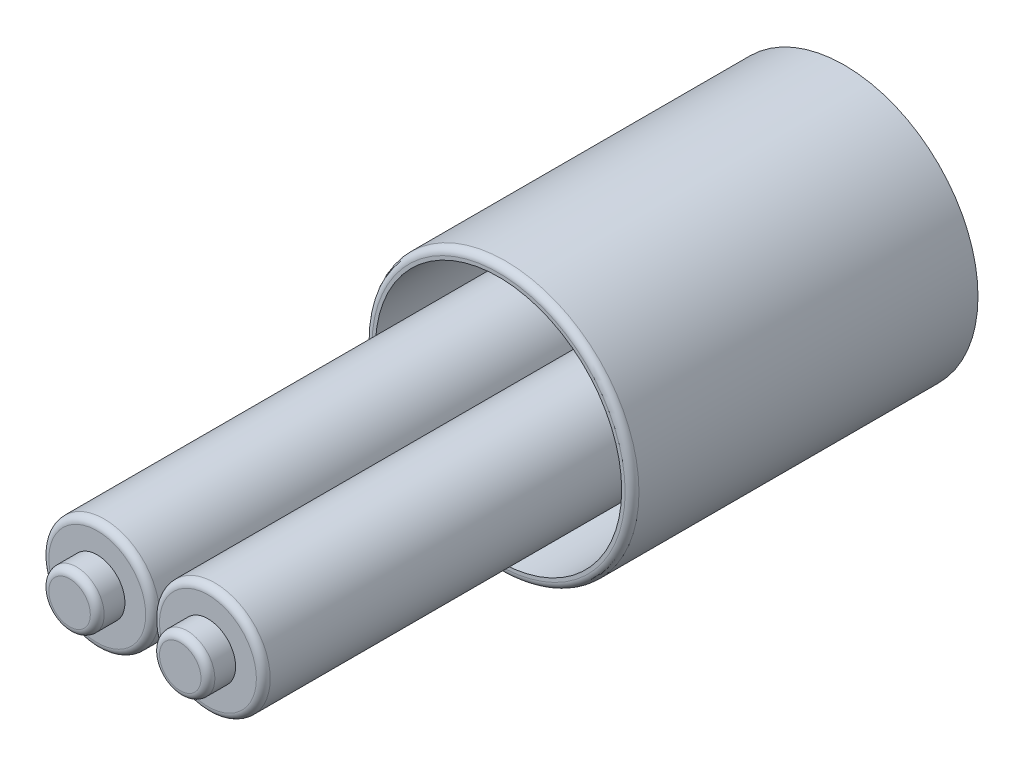
ISO-10303-21;
HEADER;
FILE_DESCRIPTION(('STEP AP214'),'2;1');
FILE_NAME('part.step','',(''),(''),'','','');
FILE_SCHEMA(('AUTOMOTIVE_DESIGN { 1 0 10303 214 1 1 1 1 }'));
ENDSEC;
DATA;
#1=APPLICATION_CONTEXT('core data for automotive mechanical design processes');
#2=APPLICATION_PROTOCOL_DEFINITION('international standard','automotive_design',2000,#1);
#3=PRODUCT_CONTEXT('',#1,'mechanical');
#4=PRODUCT('Part','Part','',(#3));
#5=PRODUCT_RELATED_PRODUCT_CATEGORY('part','',(#4));
#6=PRODUCT_DEFINITION_FORMATION('','',#4);
#7=PRODUCT_DEFINITION_CONTEXT('part definition',#1,'design');
#8=PRODUCT_DEFINITION('design','',#6,#7);
#9=PRODUCT_DEFINITION_SHAPE('','',#8);
#10=(LENGTH_UNIT() NAMED_UNIT(*) SI_UNIT(.MILLI.,.METRE.));
#11=(NAMED_UNIT(*) PLANE_ANGLE_UNIT() SI_UNIT($,.RADIAN.));
#12=(NAMED_UNIT(*) SI_UNIT($,.STERADIAN.) SOLID_ANGLE_UNIT());
#13=UNCERTAINTY_MEASURE_WITH_UNIT(LENGTH_MEASURE(1.E-05),#10,'distance_accuracy_value','');
#14=(GEOMETRIC_REPRESENTATION_CONTEXT(3) GLOBAL_UNCERTAINTY_ASSIGNED_CONTEXT((#13)) GLOBAL_UNIT_ASSIGNED_CONTEXT((#10,
#11,#12)) REPRESENTATION_CONTEXT('',''));
#15=CARTESIAN_POINT('',(0.,0.,0.));
#16=DIRECTION('',(0.,0.,1.));
#17=DIRECTION('',(1.,0.,0.));
#18=AXIS2_PLACEMENT_3D('',#15,#16,#17);
#19=CARTESIAN_POINT('',(0.1016,0.1016,1.3208));
#20=DIRECTION('',(0.,0.,-1.));
#21=DIRECTION('',(-1.,0.,0.));
#22=AXIS2_PLACEMENT_3D('',#19,#20,#21);
#23=CYLINDRICAL_SURFACE('',#22,0.0508);
#24=CARTESIAN_POINT('',(0.1016,0.1016,1.3081));
#25=DIRECTION('',(0.,0.,1.));
#26=DIRECTION('',(1.,0.,0.));
#27=AXIS2_PLACEMENT_3D('',#24,#25,#26);
#28=CIRCLE('',#27,0.0508);
#29=CARTESIAN_POINT('',(0.1524,0.1016,1.3081));
#30=VERTEX_POINT('',#29);
#31=EDGE_CURVE('E12',#30,#30,#28,.F.);
#32=ORIENTED_EDGE('',*,*,#31,.T.);
#33=EDGE_LOOP('',(#32));
#34=FACE_BOUND('',#33,.T.);
#35=CARTESIAN_POINT('',(0.1016,0.1016,0.));
#36=DIRECTION('',(0.,0.,1.));
#37=DIRECTION('',(1.,0.,0.));
#38=AXIS2_PLACEMENT_3D('',#35,#36,#37);
#39=CIRCLE('',#38,0.0508);
#40=CARTESIAN_POINT('',(0.1524,0.1016,0.));
#41=VERTEX_POINT('',#40);
#42=EDGE_CURVE('E63',#41,#41,#39,.T.);
#43=ORIENTED_EDGE('',*,*,#42,.T.);
#44=EDGE_LOOP('',(#43));
#45=FACE_BOUND('',#44,.T.);
#46=ADVANCED_FACE('F52',(#34,#45),#23,.T.);
#47=CARTESIAN_POINT('',(0.,0.,1.3208));
#48=DIRECTION('',(0.,0.,1.));
#49=DIRECTION('',(1.,0.,0.));
#50=AXIS2_PLACEMENT_3D('',#47,#48,#49);
#51=PLANE('',#50);
#52=CARTESIAN_POINT('',(0.1016,0.1016,1.3208));
#53=DIRECTION('',(0.,0.,1.));
#54=DIRECTION('',(1.,0.,0.));
#55=AXIS2_PLACEMENT_3D('',#52,#53,#54);
#56=CIRCLE('',#55,0.0381);
#57=CARTESIAN_POINT('',(0.1397,0.1016,1.3208));
#58=VERTEX_POINT('',#57);
#59=EDGE_CURVE('E59',#58,#58,#56,.T.);
#60=ORIENTED_EDGE('',*,*,#59,.T.);
#61=EDGE_LOOP('',(#60));
#62=FACE_BOUND('',#61,.T.);
#63=ADVANCED_FACE('F73',(#62),#51,.T.);
#64=CARTESIAN_POINT('',(0.,0.,0.));
#65=DIRECTION('',(0.,0.,1.));
#66=DIRECTION('',(1.,0.,0.));
#67=AXIS2_PLACEMENT_3D('',#64,#65,#66);
#68=PLANE('',#67);
#69=ORIENTED_EDGE('',*,*,#42,.F.);
#70=EDGE_LOOP('',(#69));
#71=FACE_BOUND('',#70,.T.);
#72=ADVANCED_FACE('F71',(#71),#68,.F.);
#73=CARTESIAN_POINT('',(0.1016,0.1016,1.3081));
#74=DIRECTION('',(0.,0.,1.));
#75=DIRECTION('',(1.,0.,0.));
#76=AXIS2_PLACEMENT_3D('',#73,#74,#75);
#77=TOROIDAL_SURFACE('',#76,0.0381,0.0127);
#78=ORIENTED_EDGE('',*,*,#31,.F.);
#79=EDGE_LOOP('',(#78));
#80=FACE_BOUND('',#79,.T.);
#81=ORIENTED_EDGE('',*,*,#59,.F.);
#82=EDGE_LOOP('',(#81));
#83=FACE_BOUND('',#82,.T.);
#84=ADVANCED_FACE('F54',(#80,#83),#77,.T.);
#85=CLOSED_SHELL('',(#46,#63,#72,#84));
#86=MANIFOLD_SOLID_BREP('B2',#85);
#87=CARTESIAN_POINT('',(-0.1016,0.1016,1.3208));
#88=DIRECTION('',(0.,0.,-1.));
#89=DIRECTION('',(-1.,0.,0.));
#90=AXIS2_PLACEMENT_3D('',#87,#88,#89);
#91=CYLINDRICAL_SURFACE('',#90,0.0508);
#92=CARTESIAN_POINT('',(-0.1016,0.1016,1.3081));
#93=DIRECTION('',(0.,0.,1.));
#94=DIRECTION('',(1.,0.,0.));
#95=AXIS2_PLACEMENT_3D('',#92,#93,#94);
#96=CIRCLE('',#95,0.0508);
#97=CARTESIAN_POINT('',(-0.0508,0.1016,1.3081));
#98=VERTEX_POINT('',#97);
#99=EDGE_CURVE('E51',#98,#98,#96,.F.);
#100=ORIENTED_EDGE('',*,*,#99,.T.);
#101=EDGE_LOOP('',(#100));
#102=FACE_BOUND('',#101,.T.);
#103=CARTESIAN_POINT('',(-0.1016,0.1016,0.));
#104=DIRECTION('',(0.,0.,1.));
#105=DIRECTION('',(1.,0.,0.));
#106=AXIS2_PLACEMENT_3D('',#103,#104,#105);
#107=CIRCLE('',#106,0.0508);
#108=CARTESIAN_POINT('',(-0.0508,0.1016,0.));
#109=VERTEX_POINT('',#108);
#110=EDGE_CURVE('E127',#109,#109,#107,.T.);
#111=ORIENTED_EDGE('',*,*,#110,.T.);
#112=EDGE_LOOP('',(#111));
#113=FACE_BOUND('',#112,.T.);
#114=ADVANCED_FACE('F116',(#102,#113),#91,.T.);
#115=CARTESIAN_POINT('',(0.,0.,1.3208));
#116=DIRECTION('',(0.,0.,1.));
#117=DIRECTION('',(1.,0.,0.));
#118=AXIS2_PLACEMENT_3D('',#115,#116,#117);
#119=PLANE('',#118);
#120=CARTESIAN_POINT('',(-0.1016,0.1016,1.3208));
#121=DIRECTION('',(0.,0.,1.));
#122=DIRECTION('',(1.,0.,0.));
#123=AXIS2_PLACEMENT_3D('',#120,#121,#122);
#124=CIRCLE('',#123,0.0381);
#125=CARTESIAN_POINT('',(-0.0635,0.1016,1.3208));
#126=VERTEX_POINT('',#125);
#127=EDGE_CURVE('E123',#126,#126,#124,.T.);
#128=ORIENTED_EDGE('',*,*,#127,.T.);
#129=EDGE_LOOP('',(#128));
#130=FACE_BOUND('',#129,.T.);
#131=ADVANCED_FACE('F137',(#130),#119,.T.);
#132=CARTESIAN_POINT('',(0.,0.,0.));
#133=DIRECTION('',(0.,0.,1.));
#134=DIRECTION('',(1.,0.,0.));
#135=AXIS2_PLACEMENT_3D('',#132,#133,#134);
#136=PLANE('',#135);
#137=ORIENTED_EDGE('',*,*,#110,.F.);
#138=EDGE_LOOP('',(#137));
#139=FACE_BOUND('',#138,.T.);
#140=ADVANCED_FACE('F135',(#139),#136,.F.);
#141=CARTESIAN_POINT('',(-0.1016,0.1016,1.3081));
#142=DIRECTION('',(0.,0.,1.));
#143=DIRECTION('',(1.,0.,0.));
#144=AXIS2_PLACEMENT_3D('',#141,#142,#143);
#145=TOROIDAL_SURFACE('',#144,0.0381,0.0127);
#146=ORIENTED_EDGE('',*,*,#99,.F.);
#147=EDGE_LOOP('',(#146));
#148=FACE_BOUND('',#147,.T.);
#149=ORIENTED_EDGE('',*,*,#127,.F.);
#150=EDGE_LOOP('',(#149));
#151=FACE_BOUND('',#150,.T.);
#152=ADVANCED_FACE('F118',(#148,#151),#145,.T.);
#153=CLOSED_SHELL('',(#114,#131,#140,#152));
#154=MANIFOLD_SOLID_BREP('B7',#153);
#155=CARTESIAN_POINT('',(0.,0.1016,0.635));
#156=DIRECTION('',(0.,0.,-1.));
#157=DIRECTION('',(-1.,0.,0.));
#158=AXIS2_PLACEMENT_3D('',#155,#156,#157);
#159=CYLINDRICAL_SURFACE('',#158,0.22606);
#160=CARTESIAN_POINT('',(0.,0.1016,0.635));
#161=DIRECTION('',(0.,0.,1.));
#162=DIRECTION('',(1.,0.,0.));
#163=AXIS2_PLACEMENT_3D('',#160,#161,#162);
#164=CIRCLE('',#163,0.22606);
#165=CARTESIAN_POINT('',(0.22606,0.1016,0.635));
#166=VERTEX_POINT('',#165);
#167=EDGE_CURVE('E191',#166,#166,#164,.T.);
#168=ORIENTED_EDGE('',*,*,#167,.T.);
#169=EDGE_LOOP('',(#168));
#170=FACE_BOUND('',#169,.T.);
#171=CARTESIAN_POINT('',(0.,0.1016,0.));
#172=DIRECTION('',(0.,0.,1.));
#173=DIRECTION('',(1.,0.,0.));
#174=AXIS2_PLACEMENT_3D('',#171,#172,#173);
#175=CIRCLE('',#174,0.22606);
#176=CARTESIAN_POINT('',(0.22606,0.1016,0.));
#177=VERTEX_POINT('',#176);
#178=EDGE_CURVE('E200',#177,#177,#175,.T.);
#179=ORIENTED_EDGE('',*,*,#178,.F.);
#180=EDGE_LOOP('',(#179));
#181=FACE_BOUND('',#180,.T.);
#182=ADVANCED_FACE('F180',(#170,#181),#159,.F.);
#183=CARTESIAN_POINT('',(0.,0.1016,0.635));
#184=DIRECTION('',(0.,0.,-1.));
#185=DIRECTION('',(-1.,0.,0.));
#186=AXIS2_PLACEMENT_3D('',#183,#184,#185);
#187=CYLINDRICAL_SURFACE('',#186,0.24511);
#188=CARTESIAN_POINT('',(0.,0.1016,0.6223));
#189=DIRECTION('',(0.,0.,1.));
#190=DIRECTION('',(1.,0.,0.));
#191=AXIS2_PLACEMENT_3D('',#188,#189,#190);
#192=CIRCLE('',#191,0.24511);
#193=CARTESIAN_POINT('',(0.24511,0.1016,0.6223));
#194=VERTEX_POINT('',#193);
#195=EDGE_CURVE('E115',#194,#194,#192,.F.);
#196=ORIENTED_EDGE('',*,*,#195,.T.);
#197=EDGE_LOOP('',(#196));
#198=FACE_BOUND('',#197,.T.);
#199=CARTESIAN_POINT('',(0.,0.1016,0.));
#200=DIRECTION('',(0.,0.,1.));
#201=DIRECTION('',(1.,0.,0.));
#202=AXIS2_PLACEMENT_3D('',#199,#200,#201);
#203=CIRCLE('',#202,0.24511);
#204=CARTESIAN_POINT('',(0.24511,0.1016,0.));
#205=VERTEX_POINT('',#204);
#206=EDGE_CURVE('E195',#205,#205,#203,.T.);
#207=ORIENTED_EDGE('',*,*,#206,.T.);
#208=EDGE_LOOP('',(#207));
#209=FACE_BOUND('',#208,.T.);
#210=ADVANCED_FACE('F208',(#198,#209),#187,.T.);
#211=CARTESIAN_POINT('',(0.,0.,0.635));
#212=DIRECTION('',(0.,0.,1.));
#213=DIRECTION('',(1.,0.,0.));
#214=AXIS2_PLACEMENT_3D('',#211,#212,#213);
#215=PLANE('',#214);
#216=CARTESIAN_POINT('',(0.,0.1016,0.635));
#217=DIRECTION('',(0.,0.,1.));
#218=DIRECTION('',(1.,0.,0.));
#219=AXIS2_PLACEMENT_3D('',#216,#217,#218);
#220=CIRCLE('',#219,0.23241);
#221=CARTESIAN_POINT('',(0.23241,0.1016,0.635));
#222=VERTEX_POINT('',#221);
#223=EDGE_CURVE('E187',#222,#222,#220,.T.);
#224=ORIENTED_EDGE('',*,*,#223,.T.);
#225=EDGE_LOOP('',(#224));
#226=FACE_BOUND('',#225,.T.);
#227=ORIENTED_EDGE('',*,*,#167,.F.);
#228=EDGE_LOOP('',(#227));
#229=FACE_BOUND('',#228,.T.);
#230=ADVANCED_FACE('F213',(#226,#229),#215,.T.);
#231=CARTESIAN_POINT('',(0.,0.,0.));
#232=DIRECTION('',(0.,0.,1.));
#233=DIRECTION('',(1.,0.,0.));
#234=AXIS2_PLACEMENT_3D('',#231,#232,#233);
#235=PLANE('',#234);
#236=ORIENTED_EDGE('',*,*,#178,.T.);
#237=EDGE_LOOP('',(#236));
#238=FACE_BOUND('',#237,.T.);
#239=ORIENTED_EDGE('',*,*,#206,.F.);
#240=EDGE_LOOP('',(#239));
#241=FACE_BOUND('',#240,.T.);
#242=ADVANCED_FACE('F204',(#238,#241),#235,.F.);
#243=CARTESIAN_POINT('',(0.,0.1016,0.6223));
#244=DIRECTION('',(0.,0.,1.));
#245=DIRECTION('',(1.,0.,0.));
#246=AXIS2_PLACEMENT_3D('',#243,#244,#245);
#247=TOROIDAL_SURFACE('',#246,0.23241,0.0127);
#248=ORIENTED_EDGE('',*,*,#195,.F.);
#249=EDGE_LOOP('',(#248));
#250=FACE_BOUND('',#249,.T.);
#251=ORIENTED_EDGE('',*,*,#223,.F.);
#252=EDGE_LOOP('',(#251));
#253=FACE_BOUND('',#252,.T.);
#254=ADVANCED_FACE('F182',(#250,#253),#247,.T.);
#255=CLOSED_SHELL('',(#182,#210,#230,#242,#254));
#256=MANIFOLD_SOLID_BREP('B46',#255);
#257=CARTESIAN_POINT('',(0.1016,0.1016,1.27));
#258=DIRECTION('',(0.,0.,-1.));
#259=DIRECTION('',(-1.,0.,0.));
#260=AXIS2_PLACEMENT_3D('',#257,#258,#259);
#261=CYLINDRICAL_SURFACE('',#260,0.0508);
#262=CARTESIAN_POINT('',(0.1016,0.1016,1.27));
#263=DIRECTION('',(0.,0.,1.));
#264=DIRECTION('',(1.,0.,0.));
#265=AXIS2_PLACEMENT_3D('',#262,#263,#264);
#266=CIRCLE('',#265,0.0508);
#267=CARTESIAN_POINT('',(0.1524,0.1016,1.27));
#268=VERTEX_POINT('',#267);
#269=EDGE_CURVE('E279',#268,#268,#266,.T.);
#270=ORIENTED_EDGE('',*,*,#269,.T.);
#271=EDGE_LOOP('',(#270));
#272=FACE_BOUND('',#271,.T.);
#273=CARTESIAN_POINT('',(0.1016,0.1016,0.));
#274=DIRECTION('',(0.,0.,1.));
#275=DIRECTION('',(1.,0.,0.));
#276=AXIS2_PLACEMENT_3D('',#273,#274,#275);
#277=CIRCLE('',#276,0.0508);
#278=CARTESIAN_POINT('',(0.1524,0.1016,0.));
#279=VERTEX_POINT('',#278);
#280=EDGE_CURVE('E288',#279,#279,#277,.T.);
#281=ORIENTED_EDGE('',*,*,#280,.F.);
#282=EDGE_LOOP('',(#281));
#283=FACE_BOUND('',#282,.T.);
#284=ADVANCED_FACE('F268',(#272,#283),#261,.F.);
#285=CARTESIAN_POINT('',(0.1016,0.1016,1.27));
#286=DIRECTION('',(0.,0.,-1.));
#287=DIRECTION('',(-1.,0.,0.));
#288=AXIS2_PLACEMENT_3D('',#285,#286,#287);
#289=CYLINDRICAL_SURFACE('',#288,0.1016);
#290=CARTESIAN_POINT('',(0.1016,0.1016,1.2573));
#291=DIRECTION('',(0.,0.,1.));
#292=DIRECTION('',(1.,0.,0.));
#293=AXIS2_PLACEMENT_3D('',#290,#291,#292);
#294=CIRCLE('',#293,0.1016);
#295=CARTESIAN_POINT('',(0.2032,0.1016,1.2573));
#296=VERTEX_POINT('',#295);
#297=EDGE_CURVE('E179',#296,#296,#294,.F.);
#298=ORIENTED_EDGE('',*,*,#297,.T.);
#299=EDGE_LOOP('',(#298));
#300=FACE_BOUND('',#299,.T.);
#301=CARTESIAN_POINT('',(0.1016,0.1016,0.));
#302=DIRECTION('',(0.,0.,1.));
#303=DIRECTION('',(1.,0.,0.));
#304=AXIS2_PLACEMENT_3D('',#301,#302,#303);
#305=CIRCLE('',#304,0.1016);
#306=CARTESIAN_POINT('',(0.2032,0.1016,0.));
#307=VERTEX_POINT('',#306);
#308=EDGE_CURVE('E283',#307,#307,#305,.T.);
#309=ORIENTED_EDGE('',*,*,#308,.T.);
#310=EDGE_LOOP('',(#309));
#311=FACE_BOUND('',#310,.T.);
#312=ADVANCED_FACE('F296',(#300,#311),#289,.T.);
#313=CARTESIAN_POINT('',(0.,0.,1.27));
#314=DIRECTION('',(0.,0.,1.));
#315=DIRECTION('',(1.,0.,0.));
#316=AXIS2_PLACEMENT_3D('',#313,#314,#315);
#317=PLANE('',#316);
#318=CARTESIAN_POINT('',(0.1016,0.1016,1.27));
#319=DIRECTION('',(0.,0.,1.));
#320=DIRECTION('',(1.,0.,0.));
#321=AXIS2_PLACEMENT_3D('',#318,#319,#320);
#322=CIRCLE('',#321,0.0889);
#323=CARTESIAN_POINT('',(0.1905,0.1016,1.27));
#324=VERTEX_POINT('',#323);
#325=EDGE_CURVE('E275',#324,#324,#322,.T.);
#326=ORIENTED_EDGE('',*,*,#325,.T.);
#327=EDGE_LOOP('',(#326));
#328=FACE_BOUND('',#327,.T.);
#329=ORIENTED_EDGE('',*,*,#269,.F.);
#330=EDGE_LOOP('',(#329));
#331=FACE_BOUND('',#330,.T.);
#332=ADVANCED_FACE('F301',(#328,#331),#317,.T.);
#333=CARTESIAN_POINT('',(0.,0.,0.));
#334=DIRECTION('',(0.,0.,1.));
#335=DIRECTION('',(1.,0.,0.));
#336=AXIS2_PLACEMENT_3D('',#333,#334,#335);
#337=PLANE('',#336);
#338=ORIENTED_EDGE('',*,*,#280,.T.);
#339=EDGE_LOOP('',(#338));
#340=FACE_BOUND('',#339,.T.);
#341=ORIENTED_EDGE('',*,*,#308,.F.);
#342=EDGE_LOOP('',(#341));
#343=FACE_BOUND('',#342,.T.);
#344=ADVANCED_FACE('F292',(#340,#343),#337,.F.);
#345=CARTESIAN_POINT('',(0.1016,0.1016,1.2573));
#346=DIRECTION('',(0.,0.,1.));
#347=DIRECTION('',(1.,0.,0.));
#348=AXIS2_PLACEMENT_3D('',#345,#346,#347);
#349=TOROIDAL_SURFACE('',#348,0.0889,0.0127);
#350=ORIENTED_EDGE('',*,*,#297,.F.);
#351=EDGE_LOOP('',(#350));
#352=FACE_BOUND('',#351,.T.);
#353=ORIENTED_EDGE('',*,*,#325,.F.);
#354=EDGE_LOOP('',(#353));
#355=FACE_BOUND('',#354,.T.);
#356=ADVANCED_FACE('F270',(#352,#355),#349,.T.);
#357=CLOSED_SHELL('',(#284,#312,#332,#344,#356));
#358=MANIFOLD_SOLID_BREP('B110',#357);
#359=CARTESIAN_POINT('',(-0.1016,0.1016,1.27));
#360=DIRECTION('',(0.,0.,-1.));
#361=DIRECTION('',(-1.,0.,0.));
#362=AXIS2_PLACEMENT_3D('',#359,#360,#361);
#363=CYLINDRICAL_SURFACE('',#362,0.0508);
#364=CARTESIAN_POINT('',(-0.1016,0.1016,1.27));
#365=DIRECTION('',(0.,0.,1.));
#366=DIRECTION('',(1.,0.,0.));
#367=AXIS2_PLACEMENT_3D('',#364,#365,#366);
#368=CIRCLE('',#367,0.0508);
#369=CARTESIAN_POINT('',(-0.0508,0.1016,1.27));
#370=VERTEX_POINT('',#369);
#371=EDGE_CURVE('E358',#370,#370,#368,.T.);
#372=ORIENTED_EDGE('',*,*,#371,.T.);
#373=EDGE_LOOP('',(#372));
#374=FACE_BOUND('',#373,.T.);
#375=CARTESIAN_POINT('',(-0.1016,0.1016,0.));
#376=DIRECTION('',(0.,0.,1.));
#377=DIRECTION('',(1.,0.,0.));
#378=AXIS2_PLACEMENT_3D('',#375,#376,#377);
#379=CIRCLE('',#378,0.0508);
#380=CARTESIAN_POINT('',(-0.0508,0.1016,0.));
#381=VERTEX_POINT('',#380);
#382=EDGE_CURVE('E367',#381,#381,#379,.T.);
#383=ORIENTED_EDGE('',*,*,#382,.F.);
#384=EDGE_LOOP('',(#383));
#385=FACE_BOUND('',#384,.T.);
#386=ADVANCED_FACE('F347',(#374,#385),#363,.F.);
#387=CARTESIAN_POINT('',(-0.1016,0.1016,1.27));
#388=DIRECTION('',(0.,0.,-1.));
#389=DIRECTION('',(-1.,0.,0.));
#390=AXIS2_PLACEMENT_3D('',#387,#388,#389);
#391=CYLINDRICAL_SURFACE('',#390,0.1016);
#392=CARTESIAN_POINT('',(-0.1016,0.1016,1.2573));
#393=DIRECTION('',(0.,0.,1.));
#394=DIRECTION('',(1.,0.,0.));
#395=AXIS2_PLACEMENT_3D('',#392,#393,#394);
#396=CIRCLE('',#395,0.1016);
#397=CARTESIAN_POINT('',(0.,0.1016,1.2573));
#398=VERTEX_POINT('',#397);
#399=EDGE_CURVE('E267',#398,#398,#396,.F.);
#400=ORIENTED_EDGE('',*,*,#399,.T.);
#401=EDGE_LOOP('',(#400));
#402=FACE_BOUND('',#401,.T.);
#403=CARTESIAN_POINT('',(-0.1016,0.1016,0.));
#404=DIRECTION('',(0.,0.,1.));
#405=DIRECTION('',(1.,0.,0.));
#406=AXIS2_PLACEMENT_3D('',#403,#404,#405);
#407=CIRCLE('',#406,0.1016);
#408=CARTESIAN_POINT('',(0.,0.1016,0.));
#409=VERTEX_POINT('',#408);
#410=EDGE_CURVE('E362',#409,#409,#407,.T.);
#411=ORIENTED_EDGE('',*,*,#410,.T.);
#412=EDGE_LOOP('',(#411));
#413=FACE_BOUND('',#412,.T.);
#414=ADVANCED_FACE('F375',(#402,#413),#391,.T.);
#415=CARTESIAN_POINT('',(0.,0.,1.27));
#416=DIRECTION('',(0.,0.,1.));
#417=DIRECTION('',(1.,0.,0.));
#418=AXIS2_PLACEMENT_3D('',#415,#416,#417);
#419=PLANE('',#418);
#420=CARTESIAN_POINT('',(-0.1016,0.1016,1.27));
#421=DIRECTION('',(0.,0.,1.));
#422=DIRECTION('',(1.,0.,0.));
#423=AXIS2_PLACEMENT_3D('',#420,#421,#422);
#424=CIRCLE('',#423,0.0889);
#425=CARTESIAN_POINT('',(-0.0127,0.1016,1.27));
#426=VERTEX_POINT('',#425);
#427=EDGE_CURVE('E354',#426,#426,#424,.T.);
#428=ORIENTED_EDGE('',*,*,#427,.T.);
#429=EDGE_LOOP('',(#428));
#430=FACE_BOUND('',#429,.T.);
#431=ORIENTED_EDGE('',*,*,#371,.F.);
#432=EDGE_LOOP('',(#431));
#433=FACE_BOUND('',#432,.T.);
#434=ADVANCED_FACE('F380',(#430,#433),#419,.T.);
#435=CARTESIAN_POINT('',(0.,0.,0.));
#436=DIRECTION('',(0.,0.,1.));
#437=DIRECTION('',(1.,0.,0.));
#438=AXIS2_PLACEMENT_3D('',#435,#436,#437);
#439=PLANE('',#438);
#440=ORIENTED_EDGE('',*,*,#382,.T.);
#441=EDGE_LOOP('',(#440));
#442=FACE_BOUND('',#441,.T.);
#443=ORIENTED_EDGE('',*,*,#410,.F.);
#444=EDGE_LOOP('',(#443));
#445=FACE_BOUND('',#444,.T.);
#446=ADVANCED_FACE('F371',(#442,#445),#439,.F.);
#447=CARTESIAN_POINT('',(-0.1016,0.1016,1.2573));
#448=DIRECTION('',(0.,0.,1.));
#449=DIRECTION('',(1.,0.,0.));
#450=AXIS2_PLACEMENT_3D('',#447,#448,#449);
#451=TOROIDAL_SURFACE('',#450,0.0889,0.0127);
#452=ORIENTED_EDGE('',*,*,#399,.F.);
#453=EDGE_LOOP('',(#452));
#454=FACE_BOUND('',#453,.T.);
#455=ORIENTED_EDGE('',*,*,#427,.F.);
#456=EDGE_LOOP('',(#455));
#457=FACE_BOUND('',#456,.T.);
#458=ADVANCED_FACE('F349',(#454,#457),#451,.T.);
#459=CLOSED_SHELL('',(#386,#414,#434,#446,#458));
#460=MANIFOLD_SOLID_BREP('B174',#459);
#461=ADVANCED_BREP_SHAPE_REPRESENTATION('',(#18,#86,#154,#256,#358,#460),#14);
#462=SHAPE_DEFINITION_REPRESENTATION(#9,#461);
ENDSEC;
END-ISO-10303-21;
